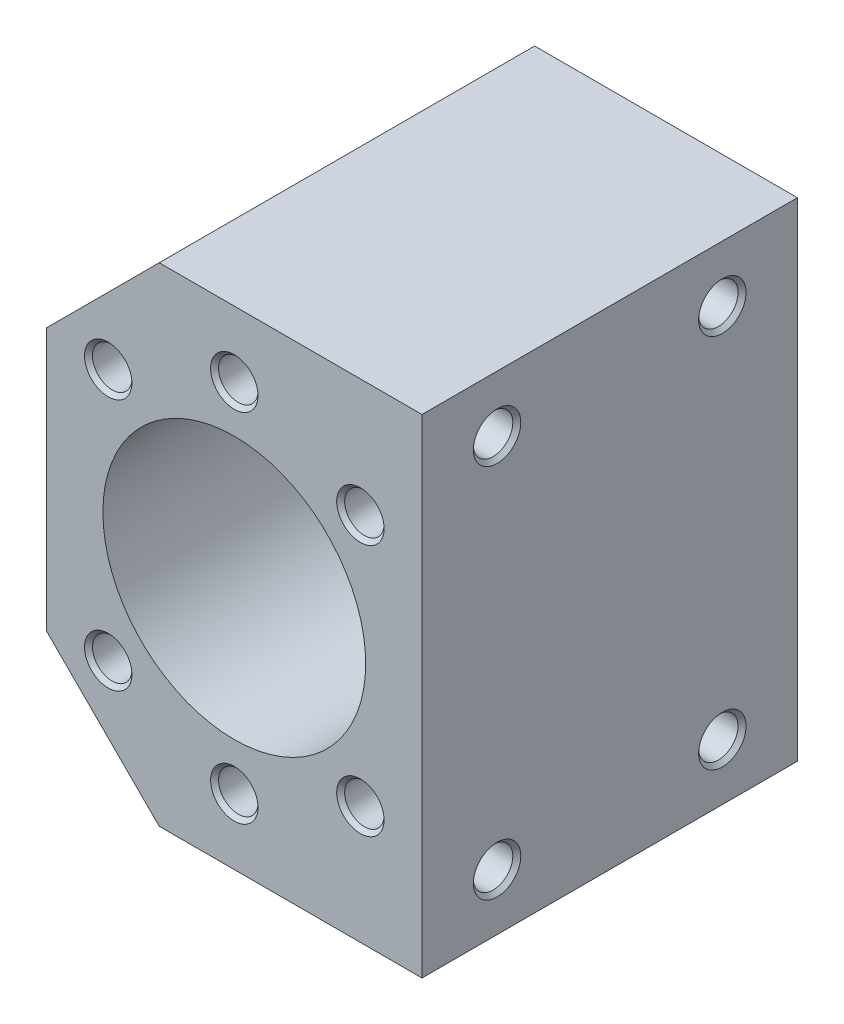
ISO-10303-21;
HEADER;
FILE_DESCRIPTION(('STEP AP214'),'2;1');
FILE_NAME('part.step','',(''),(''),'','','');
FILE_SCHEMA(('AUTOMOTIVE_DESIGN { 1 0 10303 214 1 1 1 1 }'));
ENDSEC;
DATA;
#1=APPLICATION_CONTEXT('core data for automotive mechanical design processes');
#2=APPLICATION_PROTOCOL_DEFINITION('international standard','automotive_design',2000,#1);
#3=PRODUCT_CONTEXT('',#1,'mechanical');
#4=PRODUCT('Part','Part','',(#3));
#5=PRODUCT_RELATED_PRODUCT_CATEGORY('part','',(#4));
#6=PRODUCT_DEFINITION_FORMATION('','',#4);
#7=PRODUCT_DEFINITION_CONTEXT('part definition',#1,'design');
#8=PRODUCT_DEFINITION('design','',#6,#7);
#9=PRODUCT_DEFINITION_SHAPE('','',#8);
#10=(LENGTH_UNIT() NAMED_UNIT(*) SI_UNIT(.MILLI.,.METRE.));
#11=(NAMED_UNIT(*) PLANE_ANGLE_UNIT() SI_UNIT($,.RADIAN.));
#12=(NAMED_UNIT(*) SI_UNIT($,.STERADIAN.) SOLID_ANGLE_UNIT());
#13=UNCERTAINTY_MEASURE_WITH_UNIT(LENGTH_MEASURE(1.E-05),#10,'distance_accuracy_value','');
#14=(GEOMETRIC_REPRESENTATION_CONTEXT(3) GLOBAL_UNCERTAINTY_ASSIGNED_CONTEXT((#13)) GLOBAL_UNIT_ASSIGNED_CONTEXT((#10,
#11,#12)) REPRESENTATION_CONTEXT('',''));
#15=CARTESIAN_POINT('',(0.,0.,0.));
#16=DIRECTION('',(0.,0.,1.));
#17=DIRECTION('',(1.,0.,0.));
#18=AXIS2_PLACEMENT_3D('',#15,#16,#17);
#19=CARTESIAN_POINT('',(0.,0.,20.));
#20=DIRECTION('',(0.,0.,-1.));
#21=DIRECTION('',(-1.,0.,0.));
#22=AXIS2_PLACEMENT_3D('',#19,#20,#21);
#23=PLANE('',#22);
#24=CARTESIAN_POINT('',(-13.4350288425444,13.4350288425444,20.));
#25=DIRECTION('',(0.,0.,1.));
#26=DIRECTION('',(1.,0.,0.));
#27=AXIS2_PLACEMENT_3D('',#24,#25,#26);
#28=CIRCLE('',#27,2.525);
#29=CARTESIAN_POINT('',(-10.9100288425444,13.4350288425444,20.));
#30=VERTEX_POINT('',#29);
#31=EDGE_CURVE('E166',#30,#30,#28,.T.);
#32=ORIENTED_EDGE('',*,*,#31,.F.);
#33=EDGE_LOOP('',(#32));
#34=FACE_BOUND('',#33,.T.);
#35=CARTESIAN_POINT('',(0.,19.,20.));
#36=DIRECTION('',(0.,0.,1.));
#37=DIRECTION('',(1.,0.,0.));
#38=AXIS2_PLACEMENT_3D('',#35,#36,#37);
#39=CIRCLE('',#38,2.525);
#40=CARTESIAN_POINT('',(2.525,19.,20.));
#41=VERTEX_POINT('',#40);
#42=EDGE_CURVE('E175',#41,#41,#39,.T.);
#43=ORIENTED_EDGE('',*,*,#42,.F.);
#44=EDGE_LOOP('',(#43));
#45=FACE_BOUND('',#44,.T.);
#46=CARTESIAN_POINT('',(13.4350288425444,13.4350288425444,20.));
#47=DIRECTION('',(0.,0.,1.));
#48=DIRECTION('',(1.,0.,0.));
#49=AXIS2_PLACEMENT_3D('',#46,#47,#48);
#50=CIRCLE('',#49,2.525);
#51=CARTESIAN_POINT('',(15.9600288425444,13.4350288425444,20.));
#52=VERTEX_POINT('',#51);
#53=EDGE_CURVE('E184',#52,#52,#50,.T.);
#54=ORIENTED_EDGE('',*,*,#53,.F.);
#55=EDGE_LOOP('',(#54));
#56=FACE_BOUND('',#55,.T.);
#57=CARTESIAN_POINT('',(13.4350288425444,-13.4350288425444,20.));
#58=DIRECTION('',(0.,0.,1.));
#59=DIRECTION('',(1.,0.,0.));
#60=AXIS2_PLACEMENT_3D('',#57,#58,#59);
#61=CIRCLE('',#60,2.525);
#62=CARTESIAN_POINT('',(15.9600288425444,-13.4350288425444,20.));
#63=VERTEX_POINT('',#62);
#64=EDGE_CURVE('E193',#63,#63,#61,.T.);
#65=ORIENTED_EDGE('',*,*,#64,.F.);
#66=EDGE_LOOP('',(#65));
#67=FACE_BOUND('',#66,.T.);
#68=CARTESIAN_POINT('',(0.,-19.,20.));
#69=DIRECTION('',(0.,0.,1.));
#70=DIRECTION('',(1.,0.,0.));
#71=AXIS2_PLACEMENT_3D('',#68,#69,#70);
#72=CIRCLE('',#71,2.525);
#73=CARTESIAN_POINT('',(2.525,-19.,20.));
#74=VERTEX_POINT('',#73);
#75=EDGE_CURVE('E202',#74,#74,#72,.T.);
#76=ORIENTED_EDGE('',*,*,#75,.F.);
#77=EDGE_LOOP('',(#76));
#78=FACE_BOUND('',#77,.T.);
#79=CARTESIAN_POINT('',(-13.4350288425444,-13.4350288425444,20.));
#80=DIRECTION('',(0.,0.,1.));
#81=DIRECTION('',(1.,0.,0.));
#82=AXIS2_PLACEMENT_3D('',#79,#80,#81);
#83=CIRCLE('',#82,2.525);
#84=CARTESIAN_POINT('',(-10.9100288425444,-13.4350288425444,20.));
#85=VERTEX_POINT('',#84);
#86=EDGE_CURVE('E211',#85,#85,#83,.T.);
#87=ORIENTED_EDGE('',*,*,#86,.F.);
#88=EDGE_LOOP('',(#87));
#89=FACE_BOUND('',#88,.T.);
#90=DIRECTION('',(0.,-1.,0.));
#91=VECTOR('',#90,1.);
#92=CARTESIAN_POINT('',(-20.,-26.,20.));
#93=LINE('',#92,#91);
#94=CARTESIAN_POINT('',(-20.,14.,20.));
#95=VERTEX_POINT('',#94);
#96=CARTESIAN_POINT('',(-20.,-14.,20.));
#97=VERTEX_POINT('',#96);
#98=EDGE_CURVE('E233',#95,#97,#93,.T.);
#99=ORIENTED_EDGE('',*,*,#98,.T.);
#100=DIRECTION('',(-0.707106781186546,0.707106781186549,0.));
#101=VECTOR('',#100,1.);
#102=CARTESIAN_POINT('',(-8.00000000000001,-26.,20.));
#103=LINE('',#102,#101);
#104=CARTESIAN_POINT('',(-8.00000000000001,-26.,20.));
#105=VERTEX_POINT('',#104);
#106=EDGE_CURVE('E48',#97,#105,#103,.F.);
#107=ORIENTED_EDGE('',*,*,#106,.T.);
#108=DIRECTION('',(1.,0.,0.));
#109=VECTOR('',#108,1.);
#110=CARTESIAN_POINT('',(-20.,-26.,20.));
#111=LINE('',#110,#109);
#112=CARTESIAN_POINT('',(20.,-26.,20.));
#113=VERTEX_POINT('',#112);
#114=EDGE_CURVE('E235',#105,#113,#111,.T.);
#115=ORIENTED_EDGE('',*,*,#114,.T.);
#116=DIRECTION('',(0.,1.,0.));
#117=VECTOR('',#116,1.);
#118=CARTESIAN_POINT('',(20.,-26.,20.));
#119=LINE('',#118,#117);
#120=CARTESIAN_POINT('',(20.,26.,20.));
#121=VERTEX_POINT('',#120);
#122=EDGE_CURVE('E227',#113,#121,#119,.T.);
#123=ORIENTED_EDGE('',*,*,#122,.T.);
#124=DIRECTION('',(-1.,0.,0.));
#125=VECTOR('',#124,1.);
#126=CARTESIAN_POINT('',(-20.,26.,20.));
#127=LINE('',#126,#125);
#128=CARTESIAN_POINT('',(-7.99999999999996,26.,20.));
#129=VERTEX_POINT('',#128);
#130=EDGE_CURVE('E230',#121,#129,#127,.T.);
#131=ORIENTED_EDGE('',*,*,#130,.T.);
#132=DIRECTION('',(0.707106781186549,0.707106781186546,0.));
#133=VECTOR('',#132,1.);
#134=CARTESIAN_POINT('',(-20.,14.,20.));
#135=LINE('',#134,#133);
#136=EDGE_CURVE('E261',#129,#95,#135,.F.);
#137=ORIENTED_EDGE('',*,*,#136,.T.);
#138=EDGE_LOOP('',(#99,#107,#115,#123,#131,#137));
#139=FACE_BOUND('',#138,.T.);
#140=CARTESIAN_POINT('',(0.,0.,20.));
#141=DIRECTION('',(0.,0.,1.));
#142=DIRECTION('',(1.,0.,0.));
#143=AXIS2_PLACEMENT_3D('',#140,#141,#142);
#144=CIRCLE('',#143,14.);
#145=CARTESIAN_POINT('',(14.,0.,20.));
#146=VERTEX_POINT('',#145);
#147=EDGE_CURVE('E221',#146,#146,#144,.T.);
#148=ORIENTED_EDGE('',*,*,#147,.F.);
#149=EDGE_LOOP('',(#148));
#150=FACE_BOUND('',#149,.T.);
#151=ADVANCED_FACE('F39',(#34,#45,#56,#67,#78,#89,#139,#150),#23,.F.);
#152=CARTESIAN_POINT('',(0.,0.,-20.));
#153=DIRECTION('',(0.,0.,-1.));
#154=DIRECTION('',(-1.,0.,0.));
#155=AXIS2_PLACEMENT_3D('',#152,#153,#154);
#156=PLANE('',#155);
#157=DIRECTION('',(1.,0.,0.));
#158=VECTOR('',#157,1.);
#159=CARTESIAN_POINT('',(-20.,-26.,-20.));
#160=LINE('',#159,#158);
#161=CARTESIAN_POINT('',(-8.00000000000001,-26.,-20.));
#162=VERTEX_POINT('',#161);
#163=CARTESIAN_POINT('',(20.,-26.,-20.));
#164=VERTEX_POINT('',#163);
#165=EDGE_CURVE('E231',#162,#164,#160,.T.);
#166=ORIENTED_EDGE('',*,*,#165,.F.);
#167=DIRECTION('',(0.707106781186546,-0.707106781186549,0.));
#168=VECTOR('',#167,1.);
#169=CARTESIAN_POINT('',(-17.,-17.,-20.));
#170=LINE('',#169,#168);
#171=CARTESIAN_POINT('',(-20.,-14.,-20.));
#172=VERTEX_POINT('',#171);
#173=EDGE_CURVE('E255',#162,#172,#170,.F.);
#174=ORIENTED_EDGE('',*,*,#173,.T.);
#175=DIRECTION('',(0.,-1.,0.));
#176=VECTOR('',#175,1.);
#177=CARTESIAN_POINT('',(-20.,-26.,-20.));
#178=LINE('',#177,#176);
#179=CARTESIAN_POINT('',(-20.,14.,-20.));
#180=VERTEX_POINT('',#179);
#181=EDGE_CURVE('E242',#180,#172,#178,.T.);
#182=ORIENTED_EDGE('',*,*,#181,.F.);
#183=DIRECTION('',(-0.707106781186549,-0.707106781186546,0.));
#184=VECTOR('',#183,1.);
#185=CARTESIAN_POINT('',(-17.,17.,-20.));
#186=LINE('',#185,#184);
#187=CARTESIAN_POINT('',(-7.99999999999996,26.,-20.));
#188=VERTEX_POINT('',#187);
#189=EDGE_CURVE('E253',#180,#188,#186,.F.);
#190=ORIENTED_EDGE('',*,*,#189,.T.);
#191=DIRECTION('',(-1.,0.,0.));
#192=VECTOR('',#191,1.);
#193=CARTESIAN_POINT('',(-20.,26.,-20.));
#194=LINE('',#193,#192);
#195=CARTESIAN_POINT('',(20.,26.,-20.));
#196=VERTEX_POINT('',#195);
#197=EDGE_CURVE('E240',#196,#188,#194,.T.);
#198=ORIENTED_EDGE('',*,*,#197,.F.);
#199=DIRECTION('',(0.,1.,0.));
#200=VECTOR('',#199,1.);
#201=CARTESIAN_POINT('',(20.,-26.,-20.));
#202=LINE('',#201,#200);
#203=EDGE_CURVE('E224',#164,#196,#202,.T.);
#204=ORIENTED_EDGE('',*,*,#203,.F.);
#205=EDGE_LOOP('',(#166,#174,#182,#190,#198,#204));
#206=FACE_BOUND('',#205,.T.);
#207=CARTESIAN_POINT('',(0.,0.,-20.));
#208=DIRECTION('',(0.,0.,1.));
#209=DIRECTION('',(1.,0.,0.));
#210=AXIS2_PLACEMENT_3D('',#207,#208,#209);
#211=CIRCLE('',#210,14.);
#212=CARTESIAN_POINT('',(14.,0.,-20.));
#213=VERTEX_POINT('',#212);
#214=EDGE_CURVE('E220',#213,#213,#211,.T.);
#215=ORIENTED_EDGE('',*,*,#214,.T.);
#216=EDGE_LOOP('',(#215));
#217=FACE_BOUND('',#216,.T.);
#218=ADVANCED_FACE('F276',(#206,#217),#156,.T.);
#219=CARTESIAN_POINT('',(20.,-26.,20.));
#220=DIRECTION('',(-1.,0.,0.));
#221=DIRECTION('',(0.,0.,1.));
#222=AXIS2_PLACEMENT_3D('',#219,#220,#221);
#223=PLANE('',#222);
#224=CARTESIAN_POINT('',(20.,20.,12.));
#225=DIRECTION('',(1.,0.,0.));
#226=DIRECTION('',(0.,0.,-1.));
#227=AXIS2_PLACEMENT_3D('',#224,#225,#226);
#228=CIRCLE('',#227,2.525);
#229=CARTESIAN_POINT('',(20.,20.,9.475));
#230=VERTEX_POINT('',#229);
#231=EDGE_CURVE('E139',#230,#230,#228,.T.);
#232=ORIENTED_EDGE('',*,*,#231,.F.);
#233=EDGE_LOOP('',(#232));
#234=FACE_BOUND('',#233,.T.);
#235=CARTESIAN_POINT('',(20.,20.,-12.));
#236=DIRECTION('',(1.,0.,0.));
#237=DIRECTION('',(0.,0.,-1.));
#238=AXIS2_PLACEMENT_3D('',#235,#236,#237);
#239=CIRCLE('',#238,2.525);
#240=CARTESIAN_POINT('',(20.,20.,-14.525));
#241=VERTEX_POINT('',#240);
#242=EDGE_CURVE('E132',#241,#241,#239,.T.);
#243=ORIENTED_EDGE('',*,*,#242,.F.);
#244=EDGE_LOOP('',(#243));
#245=FACE_BOUND('',#244,.T.);
#246=CARTESIAN_POINT('',(20.,-20.,-12.));
#247=DIRECTION('',(1.,0.,0.));
#248=DIRECTION('',(0.,0.,-1.));
#249=AXIS2_PLACEMENT_3D('',#246,#247,#248);
#250=CIRCLE('',#249,2.525);
#251=CARTESIAN_POINT('',(20.,-20.,-14.525));
#252=VERTEX_POINT('',#251);
#253=EDGE_CURVE('E148',#252,#252,#250,.T.);
#254=ORIENTED_EDGE('',*,*,#253,.F.);
#255=EDGE_LOOP('',(#254));
#256=FACE_BOUND('',#255,.T.);
#257=CARTESIAN_POINT('',(20.,-20.,12.));
#258=DIRECTION('',(1.,0.,0.));
#259=DIRECTION('',(0.,0.,-1.));
#260=AXIS2_PLACEMENT_3D('',#257,#258,#259);
#261=CIRCLE('',#260,2.525);
#262=CARTESIAN_POINT('',(20.,-20.,9.475));
#263=VERTEX_POINT('',#262);
#264=EDGE_CURVE('E157',#263,#263,#261,.T.);
#265=ORIENTED_EDGE('',*,*,#264,.F.);
#266=EDGE_LOOP('',(#265));
#267=FACE_BOUND('',#266,.T.);
#268=ORIENTED_EDGE('',*,*,#203,.T.);
#269=DIRECTION('',(0.,0.,-1.));
#270=VECTOR('',#269,1.);
#271=CARTESIAN_POINT('',(20.,26.,20.));
#272=LINE('',#271,#270);
#273=EDGE_CURVE('E247',#121,#196,#272,.T.);
#274=ORIENTED_EDGE('',*,*,#273,.F.);
#275=ORIENTED_EDGE('',*,*,#122,.F.);
#276=DIRECTION('',(0.,0.,-1.));
#277=VECTOR('',#276,1.);
#278=CARTESIAN_POINT('',(20.,-26.,20.));
#279=LINE('',#278,#277);
#280=EDGE_CURVE('E237',#113,#164,#279,.T.);
#281=ORIENTED_EDGE('',*,*,#280,.T.);
#282=EDGE_LOOP('',(#268,#274,#275,#281));
#283=FACE_BOUND('',#282,.T.);
#284=ADVANCED_FACE('F286',(#234,#245,#256,#267,#283),#223,.F.);
#285=CARTESIAN_POINT('',(-20.,26.,20.));
#286=DIRECTION('',(0.,-1.,0.));
#287=DIRECTION('',(0.,0.,-1.));
#288=AXIS2_PLACEMENT_3D('',#285,#286,#287);
#289=PLANE('',#288);
#290=ORIENTED_EDGE('',*,*,#197,.T.);
#291=DIRECTION('',(0.,0.,1.));
#292=VECTOR('',#291,1.);
#293=CARTESIAN_POINT('',(-7.99999999999996,26.,20.));
#294=LINE('',#293,#292);
#295=EDGE_CURVE('E11',#188,#129,#294,.T.);
#296=ORIENTED_EDGE('',*,*,#295,.T.);
#297=ORIENTED_EDGE('',*,*,#130,.F.);
#298=ORIENTED_EDGE('',*,*,#273,.T.);
#299=EDGE_LOOP('',(#290,#296,#297,#298));
#300=FACE_BOUND('',#299,.T.);
#301=ADVANCED_FACE('F283',(#300),#289,.F.);
#302=CARTESIAN_POINT('',(-20.,-26.,20.));
#303=DIRECTION('',(1.,0.,0.));
#304=DIRECTION('',(0.,0.,-1.));
#305=AXIS2_PLACEMENT_3D('',#302,#303,#304);
#306=PLANE('',#305);
#307=ORIENTED_EDGE('',*,*,#181,.T.);
#308=DIRECTION('',(0.,0.,1.));
#309=VECTOR('',#308,1.);
#310=CARTESIAN_POINT('',(-20.,-14.,20.));
#311=LINE('',#310,#309);
#312=EDGE_CURVE('E61',#172,#97,#311,.T.);
#313=ORIENTED_EDGE('',*,*,#312,.T.);
#314=ORIENTED_EDGE('',*,*,#98,.F.);
#315=DIRECTION('',(0.,0.,-1.));
#316=VECTOR('',#315,1.);
#317=CARTESIAN_POINT('',(-20.,14.,20.));
#318=LINE('',#317,#316);
#319=EDGE_CURVE('E257',#95,#180,#318,.T.);
#320=ORIENTED_EDGE('',*,*,#319,.T.);
#321=EDGE_LOOP('',(#307,#313,#314,#320));
#322=FACE_BOUND('',#321,.T.);
#323=ADVANCED_FACE('F279',(#322),#306,.F.);
#324=CARTESIAN_POINT('',(-20.,-26.,20.));
#325=DIRECTION('',(0.,1.,0.));
#326=DIRECTION('',(0.,0.,1.));
#327=AXIS2_PLACEMENT_3D('',#324,#325,#326);
#328=PLANE('',#327);
#329=ORIENTED_EDGE('',*,*,#114,.F.);
#330=DIRECTION('',(0.,0.,-1.));
#331=VECTOR('',#330,1.);
#332=CARTESIAN_POINT('',(-8.00000000000001,-26.,20.));
#333=LINE('',#332,#331);
#334=EDGE_CURVE('E250',#105,#162,#333,.T.);
#335=ORIENTED_EDGE('',*,*,#334,.T.);
#336=ORIENTED_EDGE('',*,*,#165,.T.);
#337=ORIENTED_EDGE('',*,*,#280,.F.);
#338=EDGE_LOOP('',(#329,#335,#336,#337));
#339=FACE_BOUND('',#338,.T.);
#340=ADVANCED_FACE('F270',(#339),#328,.F.);
#341=CARTESIAN_POINT('',(0.,0.,20.));
#342=DIRECTION('',(0.,0.,-1.));
#343=DIRECTION('',(-1.,0.,0.));
#344=AXIS2_PLACEMENT_3D('',#341,#342,#343);
#345=CYLINDRICAL_SURFACE('',#344,14.);
#346=ORIENTED_EDGE('',*,*,#147,.T.);
#347=EDGE_LOOP('',(#346));
#348=FACE_BOUND('',#347,.T.);
#349=ORIENTED_EDGE('',*,*,#214,.F.);
#350=EDGE_LOOP('',(#349));
#351=FACE_BOUND('',#350,.T.);
#352=ADVANCED_FACE('F306',(#348,#351),#345,.F.);
#353=CARTESIAN_POINT('',(-13.4350288425444,-13.4350288425444,10.));
#354=DIRECTION('',(0.,0.,1.));
#355=DIRECTION('',(1.,0.,0.));
#356=AXIS2_PLACEMENT_3D('',#353,#354,#355);
#357=CONICAL_SURFACE('',#356,2.1,1.02974425867665);
#358=CARTESIAN_POINT('',(-13.4350288425444,-13.4350288425444,8.73819270004212));
#359=VERTEX_POINT('',#358);
#360=VERTEX_LOOP('',#359);
#361=FACE_BOUND('',#360,.T.);
#362=CARTESIAN_POINT('',(-13.4350288425444,-13.4350288425444,10.));
#363=DIRECTION('',(0.,0.,1.));
#364=DIRECTION('',(1.,0.,0.));
#365=AXIS2_PLACEMENT_3D('',#362,#363,#364);
#366=CIRCLE('',#365,2.1);
#367=CARTESIAN_POINT('',(-11.3350288425444,-13.4350288425444,10.));
#368=VERTEX_POINT('',#367);
#369=EDGE_CURVE('E217',#368,#368,#366,.T.);
#370=ORIENTED_EDGE('',*,*,#369,.T.);
#371=EDGE_LOOP('',(#370));
#372=FACE_BOUND('',#371,.T.);
#373=ADVANCED_FACE('F327',(#361,#372),#357,.F.);
#374=CARTESIAN_POINT('',(-13.4350288425444,-13.4350288425444,20.));
#375=DIRECTION('',(0.,0.,1.));
#376=DIRECTION('',(1.,0.,0.));
#377=AXIS2_PLACEMENT_3D('',#374,#375,#376);
#378=CYLINDRICAL_SURFACE('',#377,2.1);
#379=ORIENTED_EDGE('',*,*,#369,.F.);
#380=EDGE_LOOP('',(#379));
#381=FACE_BOUND('',#380,.T.);
#382=CARTESIAN_POINT('',(-13.4350288425444,-13.4350288425444,19.575));
#383=DIRECTION('',(0.,0.,1.));
#384=DIRECTION('',(1.,0.,0.));
#385=AXIS2_PLACEMENT_3D('',#382,#383,#384);
#386=CIRCLE('',#385,2.1);
#387=CARTESIAN_POINT('',(-11.3350288425444,-13.4350288425444,19.575));
#388=VERTEX_POINT('',#387);
#389=EDGE_CURVE('E214',#388,#388,#386,.T.);
#390=ORIENTED_EDGE('',*,*,#389,.T.);
#391=EDGE_LOOP('',(#390));
#392=FACE_BOUND('',#391,.T.);
#393=ADVANCED_FACE('F334',(#381,#392),#378,.F.);
#394=CARTESIAN_POINT('',(-13.4350288425444,-13.4350288425444,20.));
#395=DIRECTION('',(0.,0.,1.));
#396=DIRECTION('',(1.,0.,0.));
#397=AXIS2_PLACEMENT_3D('',#394,#395,#396);
#398=CONICAL_SURFACE('',#397,2.525,0.785398163397446);
#399=ORIENTED_EDGE('',*,*,#389,.F.);
#400=EDGE_LOOP('',(#399));
#401=FACE_BOUND('',#400,.T.);
#402=ORIENTED_EDGE('',*,*,#86,.T.);
#403=EDGE_LOOP('',(#402));
#404=FACE_BOUND('',#403,.T.);
#405=ADVANCED_FACE('F341',(#401,#404),#398,.F.);
#406=CARTESIAN_POINT('',(0.,-19.,10.));
#407=DIRECTION('',(0.,0.,1.));
#408=DIRECTION('',(1.,0.,0.));
#409=AXIS2_PLACEMENT_3D('',#406,#407,#408);
#410=CONICAL_SURFACE('',#409,2.1,1.02974425867665);
#411=CARTESIAN_POINT('',(0.,-19.,8.73819270004212));
#412=VERTEX_POINT('',#411);
#413=VERTEX_LOOP('',#412);
#414=FACE_BOUND('',#413,.T.);
#415=CARTESIAN_POINT('',(0.,-19.,10.));
#416=DIRECTION('',(0.,0.,1.));
#417=DIRECTION('',(1.,0.,0.));
#418=AXIS2_PLACEMENT_3D('',#415,#416,#417);
#419=CIRCLE('',#418,2.1);
#420=CARTESIAN_POINT('',(2.1,-19.,10.));
#421=VERTEX_POINT('',#420);
#422=EDGE_CURVE('E208',#421,#421,#419,.T.);
#423=ORIENTED_EDGE('',*,*,#422,.T.);
#424=EDGE_LOOP('',(#423));
#425=FACE_BOUND('',#424,.T.);
#426=ADVANCED_FACE('F349',(#414,#425),#410,.F.);
#427=CARTESIAN_POINT('',(0.,-19.,20.));
#428=DIRECTION('',(0.,0.,1.));
#429=DIRECTION('',(1.,0.,0.));
#430=AXIS2_PLACEMENT_3D('',#427,#428,#429);
#431=CYLINDRICAL_SURFACE('',#430,2.1);
#432=ORIENTED_EDGE('',*,*,#422,.F.);
#433=EDGE_LOOP('',(#432));
#434=FACE_BOUND('',#433,.T.);
#435=CARTESIAN_POINT('',(0.,-19.,19.575));
#436=DIRECTION('',(0.,0.,1.));
#437=DIRECTION('',(1.,0.,0.));
#438=AXIS2_PLACEMENT_3D('',#435,#436,#437);
#439=CIRCLE('',#438,2.1);
#440=CARTESIAN_POINT('',(2.1,-19.,19.575));
#441=VERTEX_POINT('',#440);
#442=EDGE_CURVE('E205',#441,#441,#439,.T.);
#443=ORIENTED_EDGE('',*,*,#442,.T.);
#444=EDGE_LOOP('',(#443));
#445=FACE_BOUND('',#444,.T.);
#446=ADVANCED_FACE('F357',(#434,#445),#431,.F.);
#447=CARTESIAN_POINT('',(0.,-19.,20.));
#448=DIRECTION('',(0.,0.,1.));
#449=DIRECTION('',(1.,0.,0.));
#450=AXIS2_PLACEMENT_3D('',#447,#448,#449);
#451=CONICAL_SURFACE('',#450,2.525,0.785398163397448);
#452=ORIENTED_EDGE('',*,*,#442,.F.);
#453=EDGE_LOOP('',(#452));
#454=FACE_BOUND('',#453,.T.);
#455=ORIENTED_EDGE('',*,*,#75,.T.);
#456=EDGE_LOOP('',(#455));
#457=FACE_BOUND('',#456,.T.);
#458=ADVANCED_FACE('F365',(#454,#457),#451,.F.);
#459=CARTESIAN_POINT('',(13.4350288425444,-13.4350288425444,10.));
#460=DIRECTION('',(0.,0.,1.));
#461=DIRECTION('',(1.,0.,0.));
#462=AXIS2_PLACEMENT_3D('',#459,#460,#461);
#463=CONICAL_SURFACE('',#462,2.1,1.02974425867665);
#464=CARTESIAN_POINT('',(13.4350288425444,-13.4350288425444,8.73819270004212));
#465=VERTEX_POINT('',#464);
#466=VERTEX_LOOP('',#465);
#467=FACE_BOUND('',#466,.T.);
#468=CARTESIAN_POINT('',(13.4350288425444,-13.4350288425444,10.));
#469=DIRECTION('',(0.,0.,1.));
#470=DIRECTION('',(1.,0.,0.));
#471=AXIS2_PLACEMENT_3D('',#468,#469,#470);
#472=CIRCLE('',#471,2.1);
#473=CARTESIAN_POINT('',(15.5350288425444,-13.4350288425444,10.));
#474=VERTEX_POINT('',#473);
#475=EDGE_CURVE('E199',#474,#474,#472,.T.);
#476=ORIENTED_EDGE('',*,*,#475,.T.);
#477=EDGE_LOOP('',(#476));
#478=FACE_BOUND('',#477,.T.);
#479=ADVANCED_FACE('F373',(#467,#478),#463,.F.);
#480=CARTESIAN_POINT('',(13.4350288425444,-13.4350288425444,20.));
#481=DIRECTION('',(0.,0.,1.));
#482=DIRECTION('',(1.,0.,0.));
#483=AXIS2_PLACEMENT_3D('',#480,#481,#482);
#484=CYLINDRICAL_SURFACE('',#483,2.1);
#485=ORIENTED_EDGE('',*,*,#475,.F.);
#486=EDGE_LOOP('',(#485));
#487=FACE_BOUND('',#486,.T.);
#488=CARTESIAN_POINT('',(13.4350288425444,-13.4350288425444,19.575));
#489=DIRECTION('',(0.,0.,1.));
#490=DIRECTION('',(1.,0.,0.));
#491=AXIS2_PLACEMENT_3D('',#488,#489,#490);
#492=CIRCLE('',#491,2.1);
#493=CARTESIAN_POINT('',(15.5350288425444,-13.4350288425444,19.575));
#494=VERTEX_POINT('',#493);
#495=EDGE_CURVE('E196',#494,#494,#492,.T.);
#496=ORIENTED_EDGE('',*,*,#495,.T.);
#497=EDGE_LOOP('',(#496));
#498=FACE_BOUND('',#497,.T.);
#499=ADVANCED_FACE('F381',(#487,#498),#484,.F.);
#500=CARTESIAN_POINT('',(13.4350288425444,-13.4350288425444,20.));
#501=DIRECTION('',(0.,0.,1.));
#502=DIRECTION('',(1.,0.,0.));
#503=AXIS2_PLACEMENT_3D('',#500,#501,#502);
#504=CONICAL_SURFACE('',#503,2.525,0.785398163397448);
#505=ORIENTED_EDGE('',*,*,#495,.F.);
#506=EDGE_LOOP('',(#505));
#507=FACE_BOUND('',#506,.T.);
#508=ORIENTED_EDGE('',*,*,#64,.T.);
#509=EDGE_LOOP('',(#508));
#510=FACE_BOUND('',#509,.T.);
#511=ADVANCED_FACE('F389',(#507,#510),#504,.F.);
#512=CARTESIAN_POINT('',(13.4350288425444,13.4350288425444,10.));
#513=DIRECTION('',(0.,0.,1.));
#514=DIRECTION('',(1.,0.,0.));
#515=AXIS2_PLACEMENT_3D('',#512,#513,#514);
#516=CONICAL_SURFACE('',#515,2.1,1.02974425867665);
#517=CARTESIAN_POINT('',(13.4350288425444,13.4350288425444,8.73819270004212));
#518=VERTEX_POINT('',#517);
#519=VERTEX_LOOP('',#518);
#520=FACE_BOUND('',#519,.T.);
#521=CARTESIAN_POINT('',(13.4350288425444,13.4350288425444,10.));
#522=DIRECTION('',(0.,0.,1.));
#523=DIRECTION('',(1.,0.,0.));
#524=AXIS2_PLACEMENT_3D('',#521,#522,#523);
#525=CIRCLE('',#524,2.1);
#526=CARTESIAN_POINT('',(15.5350288425444,13.4350288425444,10.));
#527=VERTEX_POINT('',#526);
#528=EDGE_CURVE('E190',#527,#527,#525,.T.);
#529=ORIENTED_EDGE('',*,*,#528,.T.);
#530=EDGE_LOOP('',(#529));
#531=FACE_BOUND('',#530,.T.);
#532=ADVANCED_FACE('F397',(#520,#531),#516,.F.);
#533=CARTESIAN_POINT('',(13.4350288425444,13.4350288425444,20.));
#534=DIRECTION('',(0.,0.,1.));
#535=DIRECTION('',(1.,0.,0.));
#536=AXIS2_PLACEMENT_3D('',#533,#534,#535);
#537=CYLINDRICAL_SURFACE('',#536,2.1);
#538=ORIENTED_EDGE('',*,*,#528,.F.);
#539=EDGE_LOOP('',(#538));
#540=FACE_BOUND('',#539,.T.);
#541=CARTESIAN_POINT('',(13.4350288425444,13.4350288425444,19.575));
#542=DIRECTION('',(0.,0.,1.));
#543=DIRECTION('',(1.,0.,0.));
#544=AXIS2_PLACEMENT_3D('',#541,#542,#543);
#545=CIRCLE('',#544,2.1);
#546=CARTESIAN_POINT('',(15.5350288425444,13.4350288425444,19.575));
#547=VERTEX_POINT('',#546);
#548=EDGE_CURVE('E187',#547,#547,#545,.T.);
#549=ORIENTED_EDGE('',*,*,#548,.T.);
#550=EDGE_LOOP('',(#549));
#551=FACE_BOUND('',#550,.T.);
#552=ADVANCED_FACE('F405',(#540,#551),#537,.F.);
#553=CARTESIAN_POINT('',(13.4350288425444,13.4350288425444,20.));
#554=DIRECTION('',(0.,0.,1.));
#555=DIRECTION('',(1.,0.,0.));
#556=AXIS2_PLACEMENT_3D('',#553,#554,#555);
#557=CONICAL_SURFACE('',#556,2.525,0.785398163397448);
#558=ORIENTED_EDGE('',*,*,#548,.F.);
#559=EDGE_LOOP('',(#558));
#560=FACE_BOUND('',#559,.T.);
#561=ORIENTED_EDGE('',*,*,#53,.T.);
#562=EDGE_LOOP('',(#561));
#563=FACE_BOUND('',#562,.T.);
#564=ADVANCED_FACE('F413',(#560,#563),#557,.F.);
#565=CARTESIAN_POINT('',(0.,19.,10.));
#566=DIRECTION('',(0.,0.,1.));
#567=DIRECTION('',(1.,0.,0.));
#568=AXIS2_PLACEMENT_3D('',#565,#566,#567);
#569=CONICAL_SURFACE('',#568,2.1,1.02974425867665);
#570=CARTESIAN_POINT('',(0.,19.,8.73819270004212));
#571=VERTEX_POINT('',#570);
#572=VERTEX_LOOP('',#571);
#573=FACE_BOUND('',#572,.T.);
#574=CARTESIAN_POINT('',(0.,19.,10.));
#575=DIRECTION('',(0.,0.,1.));
#576=DIRECTION('',(1.,0.,0.));
#577=AXIS2_PLACEMENT_3D('',#574,#575,#576);
#578=CIRCLE('',#577,2.1);
#579=CARTESIAN_POINT('',(2.1,19.,10.));
#580=VERTEX_POINT('',#579);
#581=EDGE_CURVE('E181',#580,#580,#578,.T.);
#582=ORIENTED_EDGE('',*,*,#581,.T.);
#583=EDGE_LOOP('',(#582));
#584=FACE_BOUND('',#583,.T.);
#585=ADVANCED_FACE('F421',(#573,#584),#569,.F.);
#586=CARTESIAN_POINT('',(0.,19.,20.));
#587=DIRECTION('',(0.,0.,1.));
#588=DIRECTION('',(1.,0.,0.));
#589=AXIS2_PLACEMENT_3D('',#586,#587,#588);
#590=CYLINDRICAL_SURFACE('',#589,2.1);
#591=ORIENTED_EDGE('',*,*,#581,.F.);
#592=EDGE_LOOP('',(#591));
#593=FACE_BOUND('',#592,.T.);
#594=CARTESIAN_POINT('',(0.,19.,19.575));
#595=DIRECTION('',(0.,0.,1.));
#596=DIRECTION('',(1.,0.,0.));
#597=AXIS2_PLACEMENT_3D('',#594,#595,#596);
#598=CIRCLE('',#597,2.1);
#599=CARTESIAN_POINT('',(2.1,19.,19.575));
#600=VERTEX_POINT('',#599);
#601=EDGE_CURVE('E178',#600,#600,#598,.T.);
#602=ORIENTED_EDGE('',*,*,#601,.T.);
#603=EDGE_LOOP('',(#602));
#604=FACE_BOUND('',#603,.T.);
#605=ADVANCED_FACE('F429',(#593,#604),#590,.F.);
#606=CARTESIAN_POINT('',(0.,19.,20.));
#607=DIRECTION('',(0.,0.,1.));
#608=DIRECTION('',(1.,0.,0.));
#609=AXIS2_PLACEMENT_3D('',#606,#607,#608);
#610=CONICAL_SURFACE('',#609,2.525,0.785398163397448);
#611=ORIENTED_EDGE('',*,*,#601,.F.);
#612=EDGE_LOOP('',(#611));
#613=FACE_BOUND('',#612,.T.);
#614=ORIENTED_EDGE('',*,*,#42,.T.);
#615=EDGE_LOOP('',(#614));
#616=FACE_BOUND('',#615,.T.);
#617=ADVANCED_FACE('F437',(#613,#616),#610,.F.);
#618=CARTESIAN_POINT('',(-13.4350288425444,13.4350288425444,10.));
#619=DIRECTION('',(0.,0.,1.));
#620=DIRECTION('',(1.,0.,0.));
#621=AXIS2_PLACEMENT_3D('',#618,#619,#620);
#622=CONICAL_SURFACE('',#621,2.1,1.02974425867665);
#623=CARTESIAN_POINT('',(-13.4350288425444,13.4350288425444,8.73819270004212));
#624=VERTEX_POINT('',#623);
#625=VERTEX_LOOP('',#624);
#626=FACE_BOUND('',#625,.T.);
#627=CARTESIAN_POINT('',(-13.4350288425444,13.4350288425444,10.));
#628=DIRECTION('',(0.,0.,1.));
#629=DIRECTION('',(1.,0.,0.));
#630=AXIS2_PLACEMENT_3D('',#627,#628,#629);
#631=CIRCLE('',#630,2.1);
#632=CARTESIAN_POINT('',(-11.3350288425444,13.4350288425444,10.));
#633=VERTEX_POINT('',#632);
#634=EDGE_CURVE('E172',#633,#633,#631,.T.);
#635=ORIENTED_EDGE('',*,*,#634,.T.);
#636=EDGE_LOOP('',(#635));
#637=FACE_BOUND('',#636,.T.);
#638=ADVANCED_FACE('F445',(#626,#637),#622,.F.);
#639=CARTESIAN_POINT('',(-13.4350288425444,13.4350288425444,20.));
#640=DIRECTION('',(0.,0.,1.));
#641=DIRECTION('',(1.,0.,0.));
#642=AXIS2_PLACEMENT_3D('',#639,#640,#641);
#643=CYLINDRICAL_SURFACE('',#642,2.1);
#644=ORIENTED_EDGE('',*,*,#634,.F.);
#645=EDGE_LOOP('',(#644));
#646=FACE_BOUND('',#645,.T.);
#647=CARTESIAN_POINT('',(-13.4350288425444,13.4350288425444,19.575));
#648=DIRECTION('',(0.,0.,1.));
#649=DIRECTION('',(1.,0.,0.));
#650=AXIS2_PLACEMENT_3D('',#647,#648,#649);
#651=CIRCLE('',#650,2.1);
#652=CARTESIAN_POINT('',(-11.3350288425444,13.4350288425444,19.575));
#653=VERTEX_POINT('',#652);
#654=EDGE_CURVE('E169',#653,#653,#651,.T.);
#655=ORIENTED_EDGE('',*,*,#654,.T.);
#656=EDGE_LOOP('',(#655));
#657=FACE_BOUND('',#656,.T.);
#658=ADVANCED_FACE('F453',(#646,#657),#643,.F.);
#659=CARTESIAN_POINT('',(-13.4350288425444,13.4350288425444,20.));
#660=DIRECTION('',(0.,0.,1.));
#661=DIRECTION('',(1.,0.,0.));
#662=AXIS2_PLACEMENT_3D('',#659,#660,#661);
#663=CONICAL_SURFACE('',#662,2.525,0.785398163397446);
#664=ORIENTED_EDGE('',*,*,#654,.F.);
#665=EDGE_LOOP('',(#664));
#666=FACE_BOUND('',#665,.T.);
#667=ORIENTED_EDGE('',*,*,#31,.T.);
#668=EDGE_LOOP('',(#667));
#669=FACE_BOUND('',#668,.T.);
#670=ADVANCED_FACE('F461',(#666,#669),#663,.F.);
#671=CARTESIAN_POINT('',(-8.00000000000001,-26.,20.));
#672=DIRECTION('',(0.707106781186549,0.707106781186546,0.));
#673=DIRECTION('',(0.,0.,-1.));
#674=AXIS2_PLACEMENT_3D('',#671,#672,#673);
#675=PLANE('',#674);
#676=ORIENTED_EDGE('',*,*,#106,.F.);
#677=ORIENTED_EDGE('',*,*,#312,.F.);
#678=ORIENTED_EDGE('',*,*,#173,.F.);
#679=ORIENTED_EDGE('',*,*,#334,.F.);
#680=EDGE_LOOP('',(#676,#677,#678,#679));
#681=FACE_BOUND('',#680,.T.);
#682=ADVANCED_FACE('F273',(#681),#675,.F.);
#683=CARTESIAN_POINT('',(-20.,14.,20.));
#684=DIRECTION('',(0.707106781186546,-0.707106781186549,0.));
#685=DIRECTION('',(0.,0.,-1.));
#686=AXIS2_PLACEMENT_3D('',#683,#684,#685);
#687=PLANE('',#686);
#688=ORIENTED_EDGE('',*,*,#136,.F.);
#689=ORIENTED_EDGE('',*,*,#295,.F.);
#690=ORIENTED_EDGE('',*,*,#189,.F.);
#691=ORIENTED_EDGE('',*,*,#319,.F.);
#692=EDGE_LOOP('',(#688,#689,#690,#691));
#693=FACE_BOUND('',#692,.T.);
#694=ADVANCED_FACE('F42',(#693),#687,.F.);
#695=CARTESIAN_POINT('',(7.6,-20.,12.));
#696=DIRECTION('',(1.,0.,0.));
#697=DIRECTION('',(0.,0.,-1.));
#698=AXIS2_PLACEMENT_3D('',#695,#696,#697);
#699=CONICAL_SURFACE('',#698,2.1,1.02974425867665);
#700=CARTESIAN_POINT('',(6.33819270004212,-20.,12.));
#701=VERTEX_POINT('',#700);
#702=VERTEX_LOOP('',#701);
#703=FACE_BOUND('',#702,.T.);
#704=CARTESIAN_POINT('',(7.6,-20.,12.));
#705=DIRECTION('',(1.,0.,0.));
#706=DIRECTION('',(0.,0.,-1.));
#707=AXIS2_PLACEMENT_3D('',#704,#705,#706);
#708=CIRCLE('',#707,2.1);
#709=CARTESIAN_POINT('',(7.6,-20.,9.9));
#710=VERTEX_POINT('',#709);
#711=EDGE_CURVE('E163',#710,#710,#708,.T.);
#712=ORIENTED_EDGE('',*,*,#711,.T.);
#713=EDGE_LOOP('',(#712));
#714=FACE_BOUND('',#713,.T.);
#715=ADVANCED_FACE('F480',(#703,#714),#699,.F.);
#716=CARTESIAN_POINT('',(20.,-20.,12.));
#717=DIRECTION('',(1.,0.,0.));
#718=DIRECTION('',(0.,0.,-1.));
#719=AXIS2_PLACEMENT_3D('',#716,#717,#718);
#720=CYLINDRICAL_SURFACE('',#719,2.09999999999999);
#721=ORIENTED_EDGE('',*,*,#711,.F.);
#722=EDGE_LOOP('',(#721));
#723=FACE_BOUND('',#722,.T.);
#724=CARTESIAN_POINT('',(19.575,-20.,12.));
#725=DIRECTION('',(1.,0.,0.));
#726=DIRECTION('',(0.,0.,-1.));
#727=AXIS2_PLACEMENT_3D('',#724,#725,#726);
#728=CIRCLE('',#727,2.09999999999999);
#729=CARTESIAN_POINT('',(19.575,-20.,9.90000000000001));
#730=VERTEX_POINT('',#729);
#731=EDGE_CURVE('E160',#730,#730,#728,.T.);
#732=ORIENTED_EDGE('',*,*,#731,.T.);
#733=EDGE_LOOP('',(#732));
#734=FACE_BOUND('',#733,.T.);
#735=ADVANCED_FACE('F486',(#723,#734),#720,.F.);
#736=CARTESIAN_POINT('',(20.,-20.,12.));
#737=DIRECTION('',(1.,0.,0.));
#738=DIRECTION('',(0.,0.,-1.));
#739=AXIS2_PLACEMENT_3D('',#736,#737,#738);
#740=CONICAL_SURFACE('',#739,2.525,0.785398163397461);
#741=ORIENTED_EDGE('',*,*,#731,.F.);
#742=EDGE_LOOP('',(#741));
#743=FACE_BOUND('',#742,.T.);
#744=ORIENTED_EDGE('',*,*,#264,.T.);
#745=EDGE_LOOP('',(#744));
#746=FACE_BOUND('',#745,.T.);
#747=ADVANCED_FACE('F494',(#743,#746),#740,.F.);
#748=CARTESIAN_POINT('',(7.6,-20.,-12.));
#749=DIRECTION('',(1.,0.,0.));
#750=DIRECTION('',(0.,0.,-1.));
#751=AXIS2_PLACEMENT_3D('',#748,#749,#750);
#752=CONICAL_SURFACE('',#751,2.1,1.02974425867665);
#753=CARTESIAN_POINT('',(6.33819270004212,-20.,-12.));
#754=VERTEX_POINT('',#753);
#755=VERTEX_LOOP('',#754);
#756=FACE_BOUND('',#755,.T.);
#757=CARTESIAN_POINT('',(7.6,-20.,-12.));
#758=DIRECTION('',(1.,0.,0.));
#759=DIRECTION('',(0.,0.,-1.));
#760=AXIS2_PLACEMENT_3D('',#757,#758,#759);
#761=CIRCLE('',#760,2.1);
#762=CARTESIAN_POINT('',(7.6,-20.,-14.1));
#763=VERTEX_POINT('',#762);
#764=EDGE_CURVE('E154',#763,#763,#761,.T.);
#765=ORIENTED_EDGE('',*,*,#764,.T.);
#766=EDGE_LOOP('',(#765));
#767=FACE_BOUND('',#766,.T.);
#768=ADVANCED_FACE('F502',(#756,#767),#752,.F.);
#769=CARTESIAN_POINT('',(20.,-20.,-12.));
#770=DIRECTION('',(1.,0.,0.));
#771=DIRECTION('',(0.,0.,-1.));
#772=AXIS2_PLACEMENT_3D('',#769,#770,#771);
#773=CYLINDRICAL_SURFACE('',#772,2.09999999999999);
#774=ORIENTED_EDGE('',*,*,#764,.F.);
#775=EDGE_LOOP('',(#774));
#776=FACE_BOUND('',#775,.T.);
#777=CARTESIAN_POINT('',(19.575,-20.,-12.));
#778=DIRECTION('',(1.,0.,0.));
#779=DIRECTION('',(0.,0.,-1.));
#780=AXIS2_PLACEMENT_3D('',#777,#778,#779);
#781=CIRCLE('',#780,2.09999999999999);
#782=CARTESIAN_POINT('',(19.575,-20.,-14.1));
#783=VERTEX_POINT('',#782);
#784=EDGE_CURVE('E151',#783,#783,#781,.T.);
#785=ORIENTED_EDGE('',*,*,#784,.T.);
#786=EDGE_LOOP('',(#785));
#787=FACE_BOUND('',#786,.T.);
#788=ADVANCED_FACE('F510',(#776,#787),#773,.F.);
#789=CARTESIAN_POINT('',(20.,-20.,-12.));
#790=DIRECTION('',(1.,0.,0.));
#791=DIRECTION('',(0.,0.,-1.));
#792=AXIS2_PLACEMENT_3D('',#789,#790,#791);
#793=CONICAL_SURFACE('',#792,2.525,0.785398163397465);
#794=ORIENTED_EDGE('',*,*,#784,.F.);
#795=EDGE_LOOP('',(#794));
#796=FACE_BOUND('',#795,.T.);
#797=ORIENTED_EDGE('',*,*,#253,.T.);
#798=EDGE_LOOP('',(#797));
#799=FACE_BOUND('',#798,.T.);
#800=ADVANCED_FACE('F518',(#796,#799),#793,.F.);
#801=CARTESIAN_POINT('',(7.6,20.,-12.));
#802=DIRECTION('',(1.,0.,0.));
#803=DIRECTION('',(0.,0.,-1.));
#804=AXIS2_PLACEMENT_3D('',#801,#802,#803);
#805=CONICAL_SURFACE('',#804,2.1,1.02974425867665);
#806=CARTESIAN_POINT('',(6.33819270004212,20.,-12.));
#807=VERTEX_POINT('',#806);
#808=VERTEX_LOOP('',#807);
#809=FACE_BOUND('',#808,.T.);
#810=CARTESIAN_POINT('',(7.6,20.,-12.));
#811=DIRECTION('',(1.,0.,0.));
#812=DIRECTION('',(0.,0.,-1.));
#813=AXIS2_PLACEMENT_3D('',#810,#811,#812);
#814=CIRCLE('',#813,2.1);
#815=CARTESIAN_POINT('',(7.6,20.,-14.1));
#816=VERTEX_POINT('',#815);
#817=EDGE_CURVE('E145',#816,#816,#814,.T.);
#818=ORIENTED_EDGE('',*,*,#817,.T.);
#819=EDGE_LOOP('',(#818));
#820=FACE_BOUND('',#819,.T.);
#821=ADVANCED_FACE('F526',(#809,#820),#805,.F.);
#822=CARTESIAN_POINT('',(20.,20.,-12.));
#823=DIRECTION('',(1.,0.,0.));
#824=DIRECTION('',(0.,0.,-1.));
#825=AXIS2_PLACEMENT_3D('',#822,#823,#824);
#826=CYLINDRICAL_SURFACE('',#825,2.09999999999999);
#827=ORIENTED_EDGE('',*,*,#817,.F.);
#828=EDGE_LOOP('',(#827));
#829=FACE_BOUND('',#828,.T.);
#830=CARTESIAN_POINT('',(19.575,20.,-12.));
#831=DIRECTION('',(1.,0.,0.));
#832=DIRECTION('',(0.,0.,-1.));
#833=AXIS2_PLACEMENT_3D('',#830,#831,#832);
#834=CIRCLE('',#833,2.09999999999999);
#835=CARTESIAN_POINT('',(19.575,20.,-14.1));
#836=VERTEX_POINT('',#835);
#837=EDGE_CURVE('E136',#836,#836,#834,.T.);
#838=ORIENTED_EDGE('',*,*,#837,.T.);
#839=EDGE_LOOP('',(#838));
#840=FACE_BOUND('',#839,.T.);
#841=ADVANCED_FACE('F534',(#829,#840),#826,.F.);
#842=CARTESIAN_POINT('',(20.,20.,-12.));
#843=DIRECTION('',(1.,0.,0.));
#844=DIRECTION('',(0.,0.,-1.));
#845=AXIS2_PLACEMENT_3D('',#842,#843,#844);
#846=CONICAL_SURFACE('',#845,2.525,0.785398163397465);
#847=ORIENTED_EDGE('',*,*,#837,.F.);
#848=EDGE_LOOP('',(#847));
#849=FACE_BOUND('',#848,.T.);
#850=ORIENTED_EDGE('',*,*,#242,.T.);
#851=EDGE_LOOP('',(#850));
#852=FACE_BOUND('',#851,.T.);
#853=ADVANCED_FACE('F126',(#849,#852),#846,.F.);
#854=CARTESIAN_POINT('',(7.6,20.,12.));
#855=DIRECTION('',(1.,0.,0.));
#856=DIRECTION('',(0.,0.,-1.));
#857=AXIS2_PLACEMENT_3D('',#854,#855,#856);
#858=CONICAL_SURFACE('',#857,2.1,1.02974425867665);
#859=CARTESIAN_POINT('',(6.33819270004212,20.,12.));
#860=VERTEX_POINT('',#859);
#861=VERTEX_LOOP('',#860);
#862=FACE_BOUND('',#861,.T.);
#863=CARTESIAN_POINT('',(7.6,20.,12.));
#864=DIRECTION('',(1.,0.,0.));
#865=DIRECTION('',(0.,0.,-1.));
#866=AXIS2_PLACEMENT_3D('',#863,#864,#865);
#867=CIRCLE('',#866,2.1);
#868=CARTESIAN_POINT('',(7.6,20.,9.9));
#869=VERTEX_POINT('',#868);
#870=EDGE_CURVE('E130',#869,#869,#867,.T.);
#871=ORIENTED_EDGE('',*,*,#870,.T.);
#872=EDGE_LOOP('',(#871));
#873=FACE_BOUND('',#872,.T.);
#874=ADVANCED_FACE('F122',(#862,#873),#858,.F.);
#875=CARTESIAN_POINT('',(20.,20.,12.));
#876=DIRECTION('',(1.,0.,0.));
#877=DIRECTION('',(0.,0.,-1.));
#878=AXIS2_PLACEMENT_3D('',#875,#876,#877);
#879=CYLINDRICAL_SURFACE('',#878,2.09999999999999);
#880=ORIENTED_EDGE('',*,*,#870,.F.);
#881=EDGE_LOOP('',(#880));
#882=FACE_BOUND('',#881,.T.);
#883=CARTESIAN_POINT('',(19.575,20.,12.));
#884=DIRECTION('',(1.,0.,0.));
#885=DIRECTION('',(0.,0.,-1.));
#886=AXIS2_PLACEMENT_3D('',#883,#884,#885);
#887=CIRCLE('',#886,2.09999999999999);
#888=CARTESIAN_POINT('',(19.575,20.,9.90000000000001));
#889=VERTEX_POINT('',#888);
#890=EDGE_CURVE('E133',#889,#889,#887,.T.);
#891=ORIENTED_EDGE('',*,*,#890,.T.);
#892=EDGE_LOOP('',(#891));
#893=FACE_BOUND('',#892,.T.);
#894=ADVANCED_FACE('F125',(#882,#893),#879,.F.);
#895=CARTESIAN_POINT('',(20.,20.,12.));
#896=DIRECTION('',(1.,0.,0.));
#897=DIRECTION('',(0.,0.,-1.));
#898=AXIS2_PLACEMENT_3D('',#895,#896,#897);
#899=CONICAL_SURFACE('',#898,2.525,0.785398163397461);
#900=ORIENTED_EDGE('',*,*,#890,.F.);
#901=EDGE_LOOP('',(#900));
#902=FACE_BOUND('',#901,.T.);
#903=ORIENTED_EDGE('',*,*,#231,.T.);
#904=EDGE_LOOP('',(#903));
#905=FACE_BOUND('',#904,.T.);
#906=ADVANCED_FACE('F560',(#902,#905),#899,.F.);
#907=CLOSED_SHELL('',(#151,#218,#284,#301,#323,#340,#352,#373,#393,#405,#426,#446,#458,#479,
#499,#511,#532,#552,#564,#585,#605,#617,#638,#658,#670,#682,#694,#715,#735,#747,#768,#788,#800,
#821,#841,#853,#874,#894,#906));
#908=MANIFOLD_SOLID_BREP('B2',#907);
#909=ADVANCED_BREP_SHAPE_REPRESENTATION('',(#18,#908),#14);
#910=SHAPE_DEFINITION_REPRESENTATION(#9,#909);
ENDSEC;
END-ISO-10303-21;
